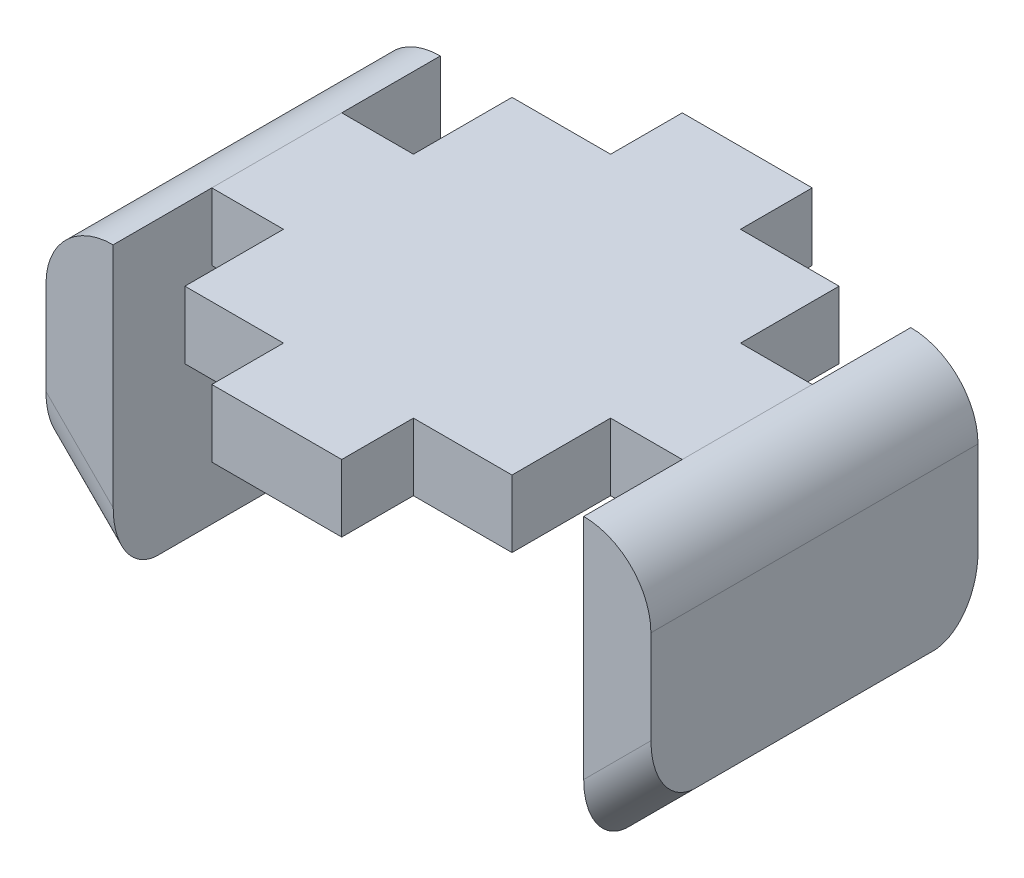
ISO-10303-21;
HEADER;
FILE_DESCRIPTION(('STEP AP214'),'2;1');
FILE_NAME('part.step','',(''),(''),'','','');
FILE_SCHEMA(('AUTOMOTIVE_DESIGN { 1 0 10303 214 1 1 1 1 }'));
ENDSEC;
DATA;
#1=APPLICATION_CONTEXT('core data for automotive mechanical design processes');
#2=APPLICATION_PROTOCOL_DEFINITION('international standard','automotive_design',2000,#1);
#3=PRODUCT_CONTEXT('',#1,'mechanical');
#4=PRODUCT('Part','Part','',(#3));
#5=PRODUCT_RELATED_PRODUCT_CATEGORY('part','',(#4));
#6=PRODUCT_DEFINITION_FORMATION('','',#4);
#7=PRODUCT_DEFINITION_CONTEXT('part definition',#1,'design');
#8=PRODUCT_DEFINITION('design','',#6,#7);
#9=PRODUCT_DEFINITION_SHAPE('','',#8);
#10=(LENGTH_UNIT() NAMED_UNIT(*) SI_UNIT(.MILLI.,.METRE.));
#11=(NAMED_UNIT(*) PLANE_ANGLE_UNIT() SI_UNIT($,.RADIAN.));
#12=(NAMED_UNIT(*) SI_UNIT($,.STERADIAN.) SOLID_ANGLE_UNIT());
#13=UNCERTAINTY_MEASURE_WITH_UNIT(LENGTH_MEASURE(1.E-05),#10,'distance_accuracy_value','');
#14=(GEOMETRIC_REPRESENTATION_CONTEXT(3) GLOBAL_UNCERTAINTY_ASSIGNED_CONTEXT((#13)) GLOBAL_UNIT_ASSIGNED_CONTEXT((#10,
#11,#12)) REPRESENTATION_CONTEXT('',''));
#15=CARTESIAN_POINT('',(0.,0.,0.));
#16=DIRECTION('',(0.,0.,1.));
#17=DIRECTION('',(1.,0.,0.));
#18=AXIS2_PLACEMENT_3D('',#15,#16,#17);
#19=CARTESIAN_POINT('',(7.3,1.5,-7.3));
#20=DIRECTION('',(-1.,0.,0.));
#21=DIRECTION('',(0.,0.,1.));
#22=AXIS2_PLACEMENT_3D('',#19,#20,#21);
#23=PLANE('',#22);
#24=DIRECTION('',(0.,-1.,0.));
#25=VECTOR('',#24,1.);
#26=CARTESIAN_POINT('',(7.3,1.5,2.9));
#27=LINE('',#26,#25);
#28=CARTESIAN_POINT('',(7.3,1.5,2.9));
#29=VERTEX_POINT('',#28);
#30=CARTESIAN_POINT('',(7.3,-1.5,2.9));
#31=VERTEX_POINT('',#30);
#32=EDGE_CURVE('E364',#29,#31,#27,.T.);
#33=ORIENTED_EDGE('',*,*,#32,.F.);
#34=DIRECTION('',(0.,0.,-1.));
#35=VECTOR('',#34,1.);
#36=CARTESIAN_POINT('',(7.3,1.5,-7.3));
#37=LINE('',#36,#35);
#38=CARTESIAN_POINT('',(7.3,1.5,7.3));
#39=VERTEX_POINT('',#38);
#40=EDGE_CURVE('E458',#39,#29,#37,.T.);
#41=ORIENTED_EDGE('',*,*,#40,.F.);
#42=DIRECTION('',(0.,-1.,0.));
#43=VECTOR('',#42,1.);
#44=CARTESIAN_POINT('',(7.3,1.5,7.3));
#45=LINE('',#44,#43);
#46=CARTESIAN_POINT('',(7.3,-1.5,7.3));
#47=VERTEX_POINT('',#46);
#48=EDGE_CURVE('E486',#39,#47,#45,.T.);
#49=ORIENTED_EDGE('',*,*,#48,.T.);
#50=DIRECTION('',(0.,0.,-1.));
#51=VECTOR('',#50,1.);
#52=CARTESIAN_POINT('',(7.3,-1.5,-7.3));
#53=LINE('',#52,#51);
#54=EDGE_CURVE('E474',#47,#31,#53,.T.);
#55=ORIENTED_EDGE('',*,*,#54,.T.);
#56=EDGE_LOOP('',(#33,#41,#49,#55));
#57=FACE_BOUND('',#56,.T.);
#58=ADVANCED_FACE('F43',(#57),#23,.F.);
#59=CARTESIAN_POINT('',(-7.3,1.5,-7.3));
#60=DIRECTION('',(1.,0.,0.));
#61=DIRECTION('',(0.,0.,-1.));
#62=AXIS2_PLACEMENT_3D('',#59,#60,#61);
#63=PLANE('',#62);
#64=DIRECTION('',(0.,-1.,0.));
#65=VECTOR('',#64,1.);
#66=CARTESIAN_POINT('',(-7.3,1.5,-2.9));
#67=LINE('',#66,#65);
#68=CARTESIAN_POINT('',(-7.3,1.5,-2.9));
#69=VERTEX_POINT('',#68);
#70=CARTESIAN_POINT('',(-7.3,-1.5,-2.9));
#71=VERTEX_POINT('',#70);
#72=EDGE_CURVE('E397',#69,#71,#67,.T.);
#73=ORIENTED_EDGE('',*,*,#72,.F.);
#74=DIRECTION('',(0.,0.,1.));
#75=VECTOR('',#74,1.);
#76=CARTESIAN_POINT('',(-7.3,1.5,-7.3));
#77=LINE('',#76,#75);
#78=CARTESIAN_POINT('',(-7.3,1.5,-7.3));
#79=VERTEX_POINT('',#78);
#80=EDGE_CURVE('E449',#79,#69,#77,.T.);
#81=ORIENTED_EDGE('',*,*,#80,.F.);
#82=DIRECTION('',(0.,-1.,0.));
#83=VECTOR('',#82,1.);
#84=CARTESIAN_POINT('',(-7.3,1.5,-7.3));
#85=LINE('',#84,#83);
#86=CARTESIAN_POINT('',(-7.3,-1.5,-7.3));
#87=VERTEX_POINT('',#86);
#88=EDGE_CURVE('E465',#79,#87,#85,.T.);
#89=ORIENTED_EDGE('',*,*,#88,.T.);
#90=DIRECTION('',(0.,0.,1.));
#91=VECTOR('',#90,1.);
#92=CARTESIAN_POINT('',(-7.3,-1.5,-7.3));
#93=LINE('',#92,#91);
#94=EDGE_CURVE('E466',#87,#71,#93,.T.);
#95=ORIENTED_EDGE('',*,*,#94,.T.);
#96=EDGE_LOOP('',(#73,#81,#89,#95));
#97=FACE_BOUND('',#96,.T.);
#98=ADVANCED_FACE('F604',(#97),#63,.F.);
#99=CARTESIAN_POINT('',(-7.3,1.5,7.3));
#100=DIRECTION('',(0.,0.,-1.));
#101=DIRECTION('',(-1.,0.,0.));
#102=AXIS2_PLACEMENT_3D('',#99,#100,#101);
#103=PLANE('',#102);
#104=DIRECTION('',(0.,-1.,0.));
#105=VECTOR('',#104,1.);
#106=CARTESIAN_POINT('',(-2.9,1.5,7.3));
#107=LINE('',#106,#105);
#108=CARTESIAN_POINT('',(-2.9,1.5,7.3));
#109=VERTEX_POINT('',#108);
#110=CARTESIAN_POINT('',(-2.9,-1.5,7.3));
#111=VERTEX_POINT('',#110);
#112=EDGE_CURVE('E421',#109,#111,#107,.T.);
#113=ORIENTED_EDGE('',*,*,#112,.F.);
#114=DIRECTION('',(1.,0.,0.));
#115=VECTOR('',#114,1.);
#116=CARTESIAN_POINT('',(-7.3,1.5,7.3));
#117=LINE('',#116,#115);
#118=CARTESIAN_POINT('',(-7.3,1.5,7.3));
#119=VERTEX_POINT('',#118);
#120=EDGE_CURVE('E454',#119,#109,#117,.T.);
#121=ORIENTED_EDGE('',*,*,#120,.F.);
#122=DIRECTION('',(0.,-1.,0.));
#123=VECTOR('',#122,1.);
#124=CARTESIAN_POINT('',(-7.3,1.5,7.3));
#125=LINE('',#124,#123);
#126=CARTESIAN_POINT('',(-7.3,-1.5,7.3));
#127=VERTEX_POINT('',#126);
#128=EDGE_CURVE('E489',#119,#127,#125,.T.);
#129=ORIENTED_EDGE('',*,*,#128,.T.);
#130=DIRECTION('',(1.,0.,0.));
#131=VECTOR('',#130,1.);
#132=CARTESIAN_POINT('',(-7.3,-1.5,7.3));
#133=LINE('',#132,#131);
#134=EDGE_CURVE('E470',#127,#111,#133,.T.);
#135=ORIENTED_EDGE('',*,*,#134,.T.);
#136=EDGE_LOOP('',(#113,#121,#129,#135));
#137=FACE_BOUND('',#136,.T.);
#138=ADVANCED_FACE('F591',(#137),#103,.F.);
#139=CARTESIAN_POINT('',(-7.3,1.5,-7.3));
#140=DIRECTION('',(0.,0.,1.));
#141=DIRECTION('',(1.,0.,0.));
#142=AXIS2_PLACEMENT_3D('',#139,#140,#141);
#143=PLANE('',#142);
#144=DIRECTION('',(0.,-1.,0.));
#145=VECTOR('',#144,1.);
#146=CARTESIAN_POINT('',(2.9,1.5,-7.3));
#147=LINE('',#146,#145);
#148=CARTESIAN_POINT('',(2.9,1.5,-7.3));
#149=VERTEX_POINT('',#148);
#150=CARTESIAN_POINT('',(2.9,-1.5,-7.3));
#151=VERTEX_POINT('',#150);
#152=EDGE_CURVE('E445',#149,#151,#147,.T.);
#153=ORIENTED_EDGE('',*,*,#152,.F.);
#154=DIRECTION('',(-1.,0.,0.));
#155=VECTOR('',#154,1.);
#156=CARTESIAN_POINT('',(-7.3,1.5,-7.3));
#157=LINE('',#156,#155);
#158=CARTESIAN_POINT('',(7.3,1.5,-7.3));
#159=VERTEX_POINT('',#158);
#160=EDGE_CURVE('E462',#159,#149,#157,.T.);
#161=ORIENTED_EDGE('',*,*,#160,.F.);
#162=DIRECTION('',(0.,-1.,0.));
#163=VECTOR('',#162,1.);
#164=CARTESIAN_POINT('',(7.3,1.5,-7.3));
#165=LINE('',#164,#163);
#166=CARTESIAN_POINT('',(7.3,-1.5,-7.3));
#167=VERTEX_POINT('',#166);
#168=EDGE_CURVE('E483',#159,#167,#165,.T.);
#169=ORIENTED_EDGE('',*,*,#168,.T.);
#170=DIRECTION('',(-1.,0.,0.));
#171=VECTOR('',#170,1.);
#172=CARTESIAN_POINT('',(-7.3,-1.5,-7.3));
#173=LINE('',#172,#171);
#174=EDGE_CURVE('E478',#167,#151,#173,.T.);
#175=ORIENTED_EDGE('',*,*,#174,.T.);
#176=EDGE_LOOP('',(#153,#161,#169,#175));
#177=FACE_BOUND('',#176,.T.);
#178=ADVANCED_FACE('F620',(#177),#143,.F.);
#179=CARTESIAN_POINT('',(-7.3,1.5,2.9));
#180=VERTEX_POINT('',#179);
#181=EDGE_CURVE('E453',#180,#119,#77,.T.);
#182=ORIENTED_EDGE('',*,*,#181,.F.);
#183=DIRECTION('',(0.,-1.,0.));
#184=VECTOR('',#183,1.);
#185=CARTESIAN_POINT('',(-7.3,1.5,2.9));
#186=LINE('',#185,#184);
#187=CARTESIAN_POINT('',(-7.3,-1.5,2.9));
#188=VERTEX_POINT('',#187);
#189=EDGE_CURVE('E383',#180,#188,#186,.T.);
#190=ORIENTED_EDGE('',*,*,#189,.T.);
#191=EDGE_CURVE('E448',#188,#127,#93,.T.);
#192=ORIENTED_EDGE('',*,*,#191,.T.);
#193=ORIENTED_EDGE('',*,*,#128,.F.);
#194=EDGE_LOOP('',(#182,#190,#192,#193));
#195=FACE_BOUND('',#194,.T.);
#196=ADVANCED_FACE('F594',(#195),#63,.F.);
#197=CARTESIAN_POINT('',(2.9,1.5,7.3));
#198=VERTEX_POINT('',#197);
#199=EDGE_CURVE('E452',#198,#39,#117,.T.);
#200=ORIENTED_EDGE('',*,*,#199,.F.);
#201=DIRECTION('',(0.,-1.,0.));
#202=VECTOR('',#201,1.);
#203=CARTESIAN_POINT('',(2.9,1.5,7.3));
#204=LINE('',#203,#202);
#205=CARTESIAN_POINT('',(2.9,-1.5,7.3));
#206=VERTEX_POINT('',#205);
#207=EDGE_CURVE('E408',#198,#206,#204,.T.);
#208=ORIENTED_EDGE('',*,*,#207,.T.);
#209=EDGE_CURVE('E469',#206,#47,#133,.T.);
#210=ORIENTED_EDGE('',*,*,#209,.T.);
#211=ORIENTED_EDGE('',*,*,#48,.F.);
#212=EDGE_LOOP('',(#200,#208,#210,#211));
#213=FACE_BOUND('',#212,.T.);
#214=ADVANCED_FACE('F574',(#213),#103,.F.);
#215=CARTESIAN_POINT('',(7.3,1.5,-2.9));
#216=VERTEX_POINT('',#215);
#217=EDGE_CURVE('E457',#216,#159,#37,.T.);
#218=ORIENTED_EDGE('',*,*,#217,.F.);
#219=DIRECTION('',(0.,-1.,0.));
#220=VECTOR('',#219,1.);
#221=CARTESIAN_POINT('',(7.3,1.5,-2.9));
#222=LINE('',#221,#220);
#223=CARTESIAN_POINT('',(7.3,-1.5,-2.9));
#224=VERTEX_POINT('',#223);
#225=EDGE_CURVE('E370',#216,#224,#222,.T.);
#226=ORIENTED_EDGE('',*,*,#225,.T.);
#227=EDGE_CURVE('E473',#224,#167,#53,.T.);
#228=ORIENTED_EDGE('',*,*,#227,.T.);
#229=ORIENTED_EDGE('',*,*,#168,.F.);
#230=EDGE_LOOP('',(#218,#226,#228,#229));
#231=FACE_BOUND('',#230,.T.);
#232=ADVANCED_FACE('F563',(#231),#23,.F.);
#233=CARTESIAN_POINT('',(-2.9,1.5,-7.3));
#234=VERTEX_POINT('',#233);
#235=EDGE_CURVE('E461',#234,#79,#157,.T.);
#236=ORIENTED_EDGE('',*,*,#235,.F.);
#237=DIRECTION('',(0.,-1.,0.));
#238=VECTOR('',#237,1.);
#239=CARTESIAN_POINT('',(-2.9,1.5,-7.3));
#240=LINE('',#239,#238);
#241=CARTESIAN_POINT('',(-2.9,-1.5,-7.3));
#242=VERTEX_POINT('',#241);
#243=EDGE_CURVE('E432',#234,#242,#240,.T.);
#244=ORIENTED_EDGE('',*,*,#243,.T.);
#245=EDGE_CURVE('E477',#242,#87,#173,.T.);
#246=ORIENTED_EDGE('',*,*,#245,.T.);
#247=ORIENTED_EDGE('',*,*,#88,.F.);
#248=EDGE_LOOP('',(#236,#244,#246,#247));
#249=FACE_BOUND('',#248,.T.);
#250=ADVANCED_FACE('F614',(#249),#143,.F.);
#251=CARTESIAN_POINT('',(0.,1.5,0.));
#252=DIRECTION('',(0.,1.,0.));
#253=DIRECTION('',(0.,0.,1.));
#254=AXIS2_PLACEMENT_3D('',#251,#252,#253);
#255=PLANE('',#254);
#256=DIRECTION('',(-1.,0.,0.));
#257=VECTOR('',#256,1.);
#258=CARTESIAN_POINT('',(-7.3,1.5,-2.9));
#259=LINE('',#258,#257);
#260=CARTESIAN_POINT('',(-10.5,1.5,-2.9));
#261=VERTEX_POINT('',#260);
#262=EDGE_CURVE('E378',#69,#261,#259,.T.);
#263=ORIENTED_EDGE('',*,*,#262,.T.);
#264=DIRECTION('',(0.,0.,-1.));
#265=VECTOR('',#264,1.);
#266=CARTESIAN_POINT('',(-10.5,1.5,0.));
#267=LINE('',#266,#265);
#268=CARTESIAN_POINT('',(-10.5,1.5,2.9));
#269=VERTEX_POINT('',#268);
#270=EDGE_CURVE('E285',#261,#269,#267,.F.);
#271=ORIENTED_EDGE('',*,*,#270,.T.);
#272=DIRECTION('',(1.,0.,0.));
#273=VECTOR('',#272,1.);
#274=CARTESIAN_POINT('',(-10.5,1.5,2.9));
#275=LINE('',#274,#273);
#276=EDGE_CURVE('E380',#269,#180,#275,.T.);
#277=ORIENTED_EDGE('',*,*,#276,.T.);
#278=ORIENTED_EDGE('',*,*,#181,.T.);
#279=ORIENTED_EDGE('',*,*,#120,.T.);
#280=DIRECTION('',(0.,0.,1.));
#281=VECTOR('',#280,1.);
#282=CARTESIAN_POINT('',(-2.9,1.5,7.3));
#283=LINE('',#282,#281);
#284=CARTESIAN_POINT('',(-2.9,1.5,10.5));
#285=VERTEX_POINT('',#284);
#286=EDGE_CURVE('E401',#109,#285,#283,.T.);
#287=ORIENTED_EDGE('',*,*,#286,.T.);
#288=DIRECTION('',(1.,0.,0.));
#289=VECTOR('',#288,1.);
#290=CARTESIAN_POINT('',(-2.9,1.5,10.5));
#291=LINE('',#290,#289);
#292=CARTESIAN_POINT('',(2.9,1.5,10.5));
#293=VERTEX_POINT('',#292);
#294=EDGE_CURVE('E403',#285,#293,#291,.T.);
#295=ORIENTED_EDGE('',*,*,#294,.T.);
#296=DIRECTION('',(0.,0.,-1.));
#297=VECTOR('',#296,1.);
#298=CARTESIAN_POINT('',(2.9,1.5,10.5));
#299=LINE('',#298,#297);
#300=EDGE_CURVE('E406',#293,#198,#299,.T.);
#301=ORIENTED_EDGE('',*,*,#300,.T.);
#302=ORIENTED_EDGE('',*,*,#199,.T.);
#303=ORIENTED_EDGE('',*,*,#40,.T.);
#304=DIRECTION('',(1.,0.,0.));
#305=VECTOR('',#304,1.);
#306=CARTESIAN_POINT('',(10.5,1.5,2.9));
#307=LINE('',#306,#305);
#308=CARTESIAN_POINT('',(10.5,1.5,2.9));
#309=VERTEX_POINT('',#308);
#310=EDGE_CURVE('E358',#29,#309,#307,.T.);
#311=ORIENTED_EDGE('',*,*,#310,.T.);
#312=DIRECTION('',(0.,0.,-1.));
#313=VECTOR('',#312,1.);
#314=CARTESIAN_POINT('',(10.5,1.5,0.));
#315=LINE('',#314,#313);
#316=CARTESIAN_POINT('',(10.5,1.5,-2.9));
#317=VERTEX_POINT('',#316);
#318=EDGE_CURVE('E496',#309,#317,#315,.T.);
#319=ORIENTED_EDGE('',*,*,#318,.T.);
#320=DIRECTION('',(-1.,0.,0.));
#321=VECTOR('',#320,1.);
#322=CARTESIAN_POINT('',(7.3,1.5,-2.9));
#323=LINE('',#322,#321);
#324=EDGE_CURVE('E361',#317,#216,#323,.T.);
#325=ORIENTED_EDGE('',*,*,#324,.T.);
#326=ORIENTED_EDGE('',*,*,#217,.T.);
#327=ORIENTED_EDGE('',*,*,#160,.T.);
#328=DIRECTION('',(0.,0.,-1.));
#329=VECTOR('',#328,1.);
#330=CARTESIAN_POINT('',(2.9,1.5,-10.5));
#331=LINE('',#330,#329);
#332=CARTESIAN_POINT('',(2.9,1.5,-10.5));
#333=VERTEX_POINT('',#332);
#334=EDGE_CURVE('E425',#149,#333,#331,.T.);
#335=ORIENTED_EDGE('',*,*,#334,.T.);
#336=DIRECTION('',(-1.,0.,0.));
#337=VECTOR('',#336,1.);
#338=CARTESIAN_POINT('',(-2.9,1.5,-10.5));
#339=LINE('',#338,#337);
#340=CARTESIAN_POINT('',(-2.9,1.5,-10.5));
#341=VERTEX_POINT('',#340);
#342=EDGE_CURVE('E427',#333,#341,#339,.T.);
#343=ORIENTED_EDGE('',*,*,#342,.T.);
#344=DIRECTION('',(0.,0.,1.));
#345=VECTOR('',#344,1.);
#346=CARTESIAN_POINT('',(-2.9,1.5,-7.3));
#347=LINE('',#346,#345);
#348=EDGE_CURVE('E430',#341,#234,#347,.T.);
#349=ORIENTED_EDGE('',*,*,#348,.T.);
#350=ORIENTED_EDGE('',*,*,#235,.T.);
#351=ORIENTED_EDGE('',*,*,#80,.T.);
#352=EDGE_LOOP('',(#263,#271,#277,#278,#279,#287,#295,#301,#302,#303,#311,#319,#325,#326,#327,
#335,#343,#349,#350,#351));
#353=FACE_BOUND('',#352,.T.);
#354=ADVANCED_FACE('F500',(#353),#255,.T.);
#355=CARTESIAN_POINT('',(0.,-1.5,0.));
#356=DIRECTION('',(0.,1.,0.));
#357=DIRECTION('',(0.,0.,1.));
#358=AXIS2_PLACEMENT_3D('',#355,#356,#357);
#359=PLANE('',#358);
#360=ORIENTED_EDGE('',*,*,#94,.F.);
#361=ORIENTED_EDGE('',*,*,#245,.F.);
#362=DIRECTION('',(0.,0.,1.));
#363=VECTOR('',#362,1.);
#364=CARTESIAN_POINT('',(-2.9,-1.5,-7.3));
#365=LINE('',#364,#363);
#366=CARTESIAN_POINT('',(-2.9,-1.5,-10.5));
#367=VERTEX_POINT('',#366);
#368=EDGE_CURVE('E428',#367,#242,#365,.T.);
#369=ORIENTED_EDGE('',*,*,#368,.F.);
#370=DIRECTION('',(-1.,0.,0.));
#371=VECTOR('',#370,1.);
#372=CARTESIAN_POINT('',(-2.9,-1.5,-10.5));
#373=LINE('',#372,#371);
#374=CARTESIAN_POINT('',(2.9,-1.5,-10.5));
#375=VERTEX_POINT('',#374);
#376=EDGE_CURVE('E434',#375,#367,#373,.T.);
#377=ORIENTED_EDGE('',*,*,#376,.F.);
#378=DIRECTION('',(0.,0.,-1.));
#379=VECTOR('',#378,1.);
#380=CARTESIAN_POINT('',(2.9,-1.5,-10.5));
#381=LINE('',#380,#379);
#382=EDGE_CURVE('E424',#151,#375,#381,.T.);
#383=ORIENTED_EDGE('',*,*,#382,.F.);
#384=ORIENTED_EDGE('',*,*,#174,.F.);
#385=ORIENTED_EDGE('',*,*,#227,.F.);
#386=DIRECTION('',(-1.,0.,0.));
#387=VECTOR('',#386,1.);
#388=CARTESIAN_POINT('',(7.3,-1.5,-2.9));
#389=LINE('',#388,#387);
#390=CARTESIAN_POINT('',(10.5,-1.5,-2.9));
#391=VERTEX_POINT('',#390);
#392=EDGE_CURVE('E362',#391,#224,#389,.T.);
#393=ORIENTED_EDGE('',*,*,#392,.F.);
#394=DIRECTION('',(0.,0.,-1.));
#395=VECTOR('',#394,1.);
#396=CARTESIAN_POINT('',(10.5,-1.5,-2.9));
#397=LINE('',#396,#395);
#398=CARTESIAN_POINT('',(10.5,-1.5,2.9));
#399=VERTEX_POINT('',#398);
#400=EDGE_CURVE('E366',#399,#391,#397,.T.);
#401=ORIENTED_EDGE('',*,*,#400,.F.);
#402=DIRECTION('',(1.,0.,0.));
#403=VECTOR('',#402,1.);
#404=CARTESIAN_POINT('',(10.5,-1.5,2.9));
#405=LINE('',#404,#403);
#406=EDGE_CURVE('E335',#31,#399,#405,.T.);
#407=ORIENTED_EDGE('',*,*,#406,.F.);
#408=ORIENTED_EDGE('',*,*,#54,.F.);
#409=ORIENTED_EDGE('',*,*,#209,.F.);
#410=DIRECTION('',(0.,0.,-1.));
#411=VECTOR('',#410,1.);
#412=CARTESIAN_POINT('',(2.9,-1.5,10.5));
#413=LINE('',#412,#411);
#414=CARTESIAN_POINT('',(2.9,-1.5,10.5));
#415=VERTEX_POINT('',#414);
#416=EDGE_CURVE('E404',#415,#206,#413,.T.);
#417=ORIENTED_EDGE('',*,*,#416,.F.);
#418=DIRECTION('',(1.,0.,0.));
#419=VECTOR('',#418,1.);
#420=CARTESIAN_POINT('',(-2.9,-1.5,10.5));
#421=LINE('',#420,#419);
#422=CARTESIAN_POINT('',(-2.9,-1.5,10.5));
#423=VERTEX_POINT('',#422);
#424=EDGE_CURVE('E410',#423,#415,#421,.T.);
#425=ORIENTED_EDGE('',*,*,#424,.F.);
#426=DIRECTION('',(0.,0.,1.));
#427=VECTOR('',#426,1.);
#428=CARTESIAN_POINT('',(-2.9,-1.5,7.3));
#429=LINE('',#428,#427);
#430=EDGE_CURVE('E400',#111,#423,#429,.T.);
#431=ORIENTED_EDGE('',*,*,#430,.F.);
#432=ORIENTED_EDGE('',*,*,#134,.F.);
#433=ORIENTED_EDGE('',*,*,#191,.F.);
#434=DIRECTION('',(1.,0.,0.));
#435=VECTOR('',#434,1.);
#436=CARTESIAN_POINT('',(-10.5,-1.5,2.9));
#437=LINE('',#436,#435);
#438=CARTESIAN_POINT('',(-10.5,-1.5,2.9));
#439=VERTEX_POINT('',#438);
#440=EDGE_CURVE('E381',#439,#188,#437,.T.);
#441=ORIENTED_EDGE('',*,*,#440,.F.);
#442=DIRECTION('',(0.,0.,1.));
#443=VECTOR('',#442,1.);
#444=CARTESIAN_POINT('',(-10.5,-1.5,-2.9));
#445=LINE('',#444,#443);
#446=CARTESIAN_POINT('',(-10.5,-1.5,-2.9));
#447=VERTEX_POINT('',#446);
#448=EDGE_CURVE('E386',#447,#439,#445,.T.);
#449=ORIENTED_EDGE('',*,*,#448,.F.);
#450=DIRECTION('',(-1.,0.,0.));
#451=VECTOR('',#450,1.);
#452=CARTESIAN_POINT('',(-7.3,-1.5,-2.9));
#453=LINE('',#452,#451);
#454=EDGE_CURVE('E377',#71,#447,#453,.T.);
#455=ORIENTED_EDGE('',*,*,#454,.F.);
#456=EDGE_LOOP('',(#360,#361,#369,#377,#383,#384,#385,#393,#401,#407,#408,#409,#417,#425,#431,
#432,#433,#441,#449,#455));
#457=FACE_BOUND('',#456,.T.);
#458=ADVANCED_FACE('F554',(#457),#359,.F.);
#459=CARTESIAN_POINT('',(2.9,1.5,-10.5));
#460=DIRECTION('',(-1.,0.,0.));
#461=DIRECTION('',(0.,0.,1.));
#462=AXIS2_PLACEMENT_3D('',#459,#460,#461);
#463=PLANE('',#462);
#464=ORIENTED_EDGE('',*,*,#382,.T.);
#465=DIRECTION('',(0.,-1.,0.));
#466=VECTOR('',#465,1.);
#467=CARTESIAN_POINT('',(2.9,1.5,-10.5));
#468=LINE('',#467,#466);
#469=EDGE_CURVE('E442',#333,#375,#468,.T.);
#470=ORIENTED_EDGE('',*,*,#469,.F.);
#471=ORIENTED_EDGE('',*,*,#334,.F.);
#472=ORIENTED_EDGE('',*,*,#152,.T.);
#473=EDGE_LOOP('',(#464,#470,#471,#472));
#474=FACE_BOUND('',#473,.T.);
#475=ADVANCED_FACE('F635',(#474),#463,.F.);
#476=CARTESIAN_POINT('',(-2.9,1.5,-10.5));
#477=DIRECTION('',(0.,0.,1.));
#478=DIRECTION('',(1.,0.,0.));
#479=AXIS2_PLACEMENT_3D('',#476,#477,#478);
#480=PLANE('',#479);
#481=ORIENTED_EDGE('',*,*,#376,.T.);
#482=DIRECTION('',(0.,-1.,0.));
#483=VECTOR('',#482,1.);
#484=CARTESIAN_POINT('',(-2.9,1.5,-10.5));
#485=LINE('',#484,#483);
#486=EDGE_CURVE('E439',#341,#367,#485,.T.);
#487=ORIENTED_EDGE('',*,*,#486,.F.);
#488=ORIENTED_EDGE('',*,*,#342,.F.);
#489=ORIENTED_EDGE('',*,*,#469,.T.);
#490=EDGE_LOOP('',(#481,#487,#488,#489));
#491=FACE_BOUND('',#490,.T.);
#492=ADVANCED_FACE('F640',(#491),#480,.F.);
#493=CARTESIAN_POINT('',(-2.9,1.5,-7.3));
#494=DIRECTION('',(1.,0.,0.));
#495=DIRECTION('',(0.,0.,-1.));
#496=AXIS2_PLACEMENT_3D('',#493,#494,#495);
#497=PLANE('',#496);
#498=ORIENTED_EDGE('',*,*,#368,.T.);
#499=ORIENTED_EDGE('',*,*,#243,.F.);
#500=ORIENTED_EDGE('',*,*,#348,.F.);
#501=ORIENTED_EDGE('',*,*,#486,.T.);
#502=EDGE_LOOP('',(#498,#499,#500,#501));
#503=FACE_BOUND('',#502,.T.);
#504=ADVANCED_FACE('F644',(#503),#497,.F.);
#505=CARTESIAN_POINT('',(-2.9,1.5,7.3));
#506=DIRECTION('',(1.,0.,0.));
#507=DIRECTION('',(0.,0.,-1.));
#508=AXIS2_PLACEMENT_3D('',#505,#506,#507);
#509=PLANE('',#508);
#510=ORIENTED_EDGE('',*,*,#430,.T.);
#511=DIRECTION('',(0.,-1.,0.));
#512=VECTOR('',#511,1.);
#513=CARTESIAN_POINT('',(-2.9,1.5,10.5));
#514=LINE('',#513,#512);
#515=EDGE_CURVE('E418',#285,#423,#514,.T.);
#516=ORIENTED_EDGE('',*,*,#515,.F.);
#517=ORIENTED_EDGE('',*,*,#286,.F.);
#518=ORIENTED_EDGE('',*,*,#112,.T.);
#519=EDGE_LOOP('',(#510,#516,#517,#518));
#520=FACE_BOUND('',#519,.T.);
#521=ADVANCED_FACE('F588',(#520),#509,.F.);
#522=CARTESIAN_POINT('',(-2.9,1.5,10.5));
#523=DIRECTION('',(0.,0.,-1.));
#524=DIRECTION('',(-1.,0.,0.));
#525=AXIS2_PLACEMENT_3D('',#522,#523,#524);
#526=PLANE('',#525);
#527=ORIENTED_EDGE('',*,*,#424,.T.);
#528=DIRECTION('',(0.,-1.,0.));
#529=VECTOR('',#528,1.);
#530=CARTESIAN_POINT('',(2.9,1.5,10.5));
#531=LINE('',#530,#529);
#532=EDGE_CURVE('E415',#293,#415,#531,.T.);
#533=ORIENTED_EDGE('',*,*,#532,.F.);
#534=ORIENTED_EDGE('',*,*,#294,.F.);
#535=ORIENTED_EDGE('',*,*,#515,.T.);
#536=EDGE_LOOP('',(#527,#533,#534,#535));
#537=FACE_BOUND('',#536,.T.);
#538=ADVANCED_FACE('F582',(#537),#526,.F.);
#539=CARTESIAN_POINT('',(2.9,1.5,10.5));
#540=DIRECTION('',(-1.,0.,0.));
#541=DIRECTION('',(0.,0.,1.));
#542=AXIS2_PLACEMENT_3D('',#539,#540,#541);
#543=PLANE('',#542);
#544=ORIENTED_EDGE('',*,*,#416,.T.);
#545=ORIENTED_EDGE('',*,*,#207,.F.);
#546=ORIENTED_EDGE('',*,*,#300,.F.);
#547=ORIENTED_EDGE('',*,*,#532,.T.);
#548=EDGE_LOOP('',(#544,#545,#546,#547));
#549=FACE_BOUND('',#548,.T.);
#550=ADVANCED_FACE('F578',(#549),#543,.F.);
#551=CARTESIAN_POINT('',(-7.3,1.5,-2.9));
#552=DIRECTION('',(0.,0.,1.));
#553=DIRECTION('',(1.,0.,0.));
#554=AXIS2_PLACEMENT_3D('',#551,#552,#553);
#555=PLANE('',#554);
#556=ORIENTED_EDGE('',*,*,#454,.T.);
#557=DIRECTION('',(0.,-1.,0.));
#558=VECTOR('',#557,1.);
#559=CARTESIAN_POINT('',(-10.5,1.5,-2.9));
#560=LINE('',#559,#558);
#561=EDGE_CURVE('E394',#261,#447,#560,.T.);
#562=ORIENTED_EDGE('',*,*,#561,.F.);
#563=ORIENTED_EDGE('',*,*,#262,.F.);
#564=ORIENTED_EDGE('',*,*,#72,.T.);
#565=EDGE_LOOP('',(#556,#562,#563,#564));
#566=FACE_BOUND('',#565,.T.);
#567=ADVANCED_FACE('F596',(#566),#555,.F.);
#568=CARTESIAN_POINT('',(-10.5,1.5,2.9));
#569=DIRECTION('',(0.,0.,-1.));
#570=DIRECTION('',(-1.,0.,0.));
#571=AXIS2_PLACEMENT_3D('',#568,#569,#570);
#572=PLANE('',#571);
#573=ORIENTED_EDGE('',*,*,#440,.T.);
#574=ORIENTED_EDGE('',*,*,#189,.F.);
#575=ORIENTED_EDGE('',*,*,#276,.F.);
#576=DIRECTION('',(0.,-1.,0.));
#577=VECTOR('',#576,1.);
#578=CARTESIAN_POINT('',(-10.5,1.5,2.9));
#579=LINE('',#578,#577);
#580=EDGE_CURVE('E392',#269,#439,#579,.T.);
#581=ORIENTED_EDGE('',*,*,#580,.T.);
#582=EDGE_LOOP('',(#573,#574,#575,#581));
#583=FACE_BOUND('',#582,.T.);
#584=ADVANCED_FACE('F507',(#583),#572,.F.);
#585=CARTESIAN_POINT('',(10.5,1.5,2.9));
#586=DIRECTION('',(0.,0.,-1.));
#587=DIRECTION('',(-1.,0.,0.));
#588=AXIS2_PLACEMENT_3D('',#585,#586,#587);
#589=PLANE('',#588);
#590=ORIENTED_EDGE('',*,*,#406,.T.);
#591=DIRECTION('',(0.,-1.,0.));
#592=VECTOR('',#591,1.);
#593=CARTESIAN_POINT('',(10.5,1.5,2.9));
#594=LINE('',#593,#592);
#595=EDGE_CURVE('E374',#309,#399,#594,.T.);
#596=ORIENTED_EDGE('',*,*,#595,.F.);
#597=ORIENTED_EDGE('',*,*,#310,.F.);
#598=ORIENTED_EDGE('',*,*,#32,.T.);
#599=EDGE_LOOP('',(#590,#596,#597,#598));
#600=FACE_BOUND('',#599,.T.);
#601=ADVANCED_FACE('F547',(#600),#589,.F.);
#602=CARTESIAN_POINT('',(7.3,1.5,-2.9));
#603=DIRECTION('',(0.,0.,1.));
#604=DIRECTION('',(1.,0.,0.));
#605=AXIS2_PLACEMENT_3D('',#602,#603,#604);
#606=PLANE('',#605);
#607=ORIENTED_EDGE('',*,*,#392,.T.);
#608=ORIENTED_EDGE('',*,*,#225,.F.);
#609=ORIENTED_EDGE('',*,*,#324,.F.);
#610=DIRECTION('',(0.,-1.,0.));
#611=VECTOR('',#610,1.);
#612=CARTESIAN_POINT('',(10.5,1.5,-2.9));
#613=LINE('',#612,#611);
#614=EDGE_CURVE('E261',#317,#391,#613,.T.);
#615=ORIENTED_EDGE('',*,*,#614,.T.);
#616=EDGE_LOOP('',(#607,#608,#609,#615));
#617=FACE_BOUND('',#616,.T.);
#618=ADVANCED_FACE('F559',(#617),#606,.F.);
#619=CARTESIAN_POINT('',(-13.5,1.5,-7.3));
#620=DIRECTION('',(0.,0.,1.));
#621=DIRECTION('',(0.,-1.,0.));
#622=AXIS2_PLACEMENT_3D('',#619,#620,#621);
#623=PLANE('',#622);
#624=DIRECTION('',(0.,-1.,0.));
#625=VECTOR('',#624,1.);
#626=CARTESIAN_POINT('',(-10.5,1.5,-7.3));
#627=LINE('',#626,#625);
#628=CARTESIAN_POINT('',(-10.5,1.5,-7.3));
#629=VERTEX_POINT('',#628);
#630=CARTESIAN_POINT('',(-10.5,-8.6715728752538,-7.3));
#631=VERTEX_POINT('',#630);
#632=EDGE_CURVE('E347',#629,#631,#627,.T.);
#633=ORIENTED_EDGE('',*,*,#632,.T.);
#634=DIRECTION('',(-0.707106781186549,0.707106781186546,0.));
#635=VECTOR('',#634,1.);
#636=CARTESIAN_POINT('',(-12.0857864376269,-7.0857864376269,-7.3));
#637=LINE('',#636,#635);
#638=CARTESIAN_POINT('',(-13.5,-5.67157287525381,-7.3));
#639=VERTEX_POINT('',#638);
#640=EDGE_CURVE('E11',#631,#639,#637,.T.);
#641=ORIENTED_EDGE('',*,*,#640,.T.);
#642=DIRECTION('',(0.,-1.,0.));
#643=VECTOR('',#642,1.);
#644=CARTESIAN_POINT('',(-13.5,1.5,-7.3));
#645=LINE('',#644,#643);
#646=CARTESIAN_POINT('',(-13.5,-1.5,-7.3));
#647=VERTEX_POINT('',#646);
#648=EDGE_CURVE('E336',#647,#639,#645,.T.);
#649=ORIENTED_EDGE('',*,*,#648,.F.);
#650=CARTESIAN_POINT('',(-10.5,-1.5,-7.3));
#651=DIRECTION('',(0.,0.,1.));
#652=DIRECTION('',(0.,-1.,0.));
#653=AXIS2_PLACEMENT_3D('',#650,#651,#652);
#654=CIRCLE('',#653,3.);
#655=EDGE_CURVE('E494',#647,#629,#654,.F.);
#656=ORIENTED_EDGE('',*,*,#655,.T.);
#657=EDGE_LOOP('',(#633,#641,#649,#656));
#658=FACE_BOUND('',#657,.T.);
#659=ADVANCED_FACE('F514',(#658),#623,.F.);
#660=CARTESIAN_POINT('',(-13.5,1.5,7.3));
#661=DIRECTION('',(0.,0.,-1.));
#662=DIRECTION('',(0.,1.,0.));
#663=AXIS2_PLACEMENT_3D('',#660,#661,#662);
#664=PLANE('',#663);
#665=DIRECTION('',(0.,1.,0.));
#666=VECTOR('',#665,1.);
#667=CARTESIAN_POINT('',(-13.5,1.5,7.3));
#668=LINE('',#667,#666);
#669=CARTESIAN_POINT('',(-13.5,-5.67157287525381,7.3));
#670=VERTEX_POINT('',#669);
#671=CARTESIAN_POINT('',(-13.5,-1.5,7.3));
#672=VERTEX_POINT('',#671);
#673=EDGE_CURVE('E327',#670,#672,#668,.T.);
#674=ORIENTED_EDGE('',*,*,#673,.F.);
#675=DIRECTION('',(0.707106781186549,-0.707106781186546,0.));
#676=VECTOR('',#675,1.);
#677=CARTESIAN_POINT('',(-9.0857864376269,-10.0857864376269,7.3));
#678=LINE('',#677,#676);
#679=CARTESIAN_POINT('',(-10.5,-8.6715728752538,7.3));
#680=VERTEX_POINT('',#679);
#681=EDGE_CURVE('E312',#670,#680,#678,.T.);
#682=ORIENTED_EDGE('',*,*,#681,.T.);
#683=DIRECTION('',(0.,1.,0.));
#684=VECTOR('',#683,1.);
#685=CARTESIAN_POINT('',(-10.5,1.5,7.3));
#686=LINE('',#685,#684);
#687=CARTESIAN_POINT('',(-10.5,1.5,7.3));
#688=VERTEX_POINT('',#687);
#689=EDGE_CURVE('E345',#680,#688,#686,.T.);
#690=ORIENTED_EDGE('',*,*,#689,.T.);
#691=CARTESIAN_POINT('',(-10.5,-1.5,7.3));
#692=DIRECTION('',(0.,0.,-1.));
#693=DIRECTION('',(0.,1.,0.));
#694=AXIS2_PLACEMENT_3D('',#691,#692,#693);
#695=CIRCLE('',#694,3.);
#696=EDGE_CURVE('E280',#688,#672,#695,.F.);
#697=ORIENTED_EDGE('',*,*,#696,.T.);
#698=EDGE_LOOP('',(#674,#682,#690,#697));
#699=FACE_BOUND('',#698,.T.);
#700=ADVANCED_FACE('F331',(#699),#664,.F.);
#701=CARTESIAN_POINT('',(-13.5,0.,0.));
#702=DIRECTION('',(-1.,0.,0.));
#703=DIRECTION('',(0.,0.,1.));
#704=AXIS2_PLACEMENT_3D('',#701,#702,#703);
#705=PLANE('',#704);
#706=DIRECTION('',(0.,0.,1.));
#707=VECTOR('',#706,1.);
#708=CARTESIAN_POINT('',(-13.5,-8.5,7.3));
#709=LINE('',#708,#707);
#710=CARTESIAN_POINT('',(-13.5,-8.5,-5.3));
#711=VERTEX_POINT('',#710);
#712=CARTESIAN_POINT('',(-13.5,-8.5,5.3));
#713=VERTEX_POINT('',#712);
#714=EDGE_CURVE('E291',#711,#713,#709,.T.);
#715=ORIENTED_EDGE('',*,*,#714,.T.);
#716=CARTESIAN_POINT('',(-13.5,-5.67157287525381,5.3));
#717=DIRECTION('',(-1.,0.,0.));
#718=DIRECTION('',(0.,1.,0.));
#719=AXIS2_PLACEMENT_3D('',#716,#717,#718);
#720=ELLIPSE('',#719,2.82842712474619,2.);
#721=EDGE_CURVE('E51',#713,#670,#720,.T.);
#722=ORIENTED_EDGE('',*,*,#721,.T.);
#723=ORIENTED_EDGE('',*,*,#673,.T.);
#724=DIRECTION('',(0.,0.,-1.));
#725=VECTOR('',#724,1.);
#726=CARTESIAN_POINT('',(-13.5,-1.5,0.));
#727=LINE('',#726,#725);
#728=EDGE_CURVE('E492',#672,#647,#727,.T.);
#729=ORIENTED_EDGE('',*,*,#728,.T.);
#730=ORIENTED_EDGE('',*,*,#648,.T.);
#731=CARTESIAN_POINT('',(-13.5,-5.67157287525381,-5.3));
#732=DIRECTION('',(-1.,0.,0.));
#733=DIRECTION('',(0.,-1.,0.));
#734=AXIS2_PLACEMENT_3D('',#731,#732,#733);
#735=ELLIPSE('',#734,2.82842712474619,2.);
#736=EDGE_CURVE('E58',#639,#711,#735,.T.);
#737=ORIENTED_EDGE('',*,*,#736,.T.);
#738=EDGE_LOOP('',(#715,#722,#723,#729,#730,#737));
#739=FACE_BOUND('',#738,.T.);
#740=ADVANCED_FACE('F325',(#739),#705,.T.);
#741=CARTESIAN_POINT('',(-10.5,0.,0.));
#742=DIRECTION('',(-1.,0.,0.));
#743=DIRECTION('',(0.,0.,1.));
#744=AXIS2_PLACEMENT_3D('',#741,#742,#743);
#745=PLANE('',#744);
#746=ORIENTED_EDGE('',*,*,#689,.F.);
#747=CARTESIAN_POINT('',(-10.5,-8.6715728752538,5.3));
#748=DIRECTION('',(-1.,0.,0.));
#749=DIRECTION('',(0.,1.,0.));
#750=AXIS2_PLACEMENT_3D('',#747,#748,#749);
#751=ELLIPSE('',#750,2.82842712474619,2.);
#752=CARTESIAN_POINT('',(-10.5,-11.5,5.3));
#753=VERTEX_POINT('',#752);
#754=EDGE_CURVE('E317',#680,#753,#751,.F.);
#755=ORIENTED_EDGE('',*,*,#754,.T.);
#756=DIRECTION('',(0.,0.,1.));
#757=VECTOR('',#756,1.);
#758=CARTESIAN_POINT('',(-10.5,-11.5,-7.3));
#759=LINE('',#758,#757);
#760=CARTESIAN_POINT('',(-10.5,-11.5,-5.3));
#761=VERTEX_POINT('',#760);
#762=EDGE_CURVE('E342',#761,#753,#759,.T.);
#763=ORIENTED_EDGE('',*,*,#762,.F.);
#764=CARTESIAN_POINT('',(-10.5,-8.6715728752538,-5.3));
#765=DIRECTION('',(-1.,0.,0.));
#766=DIRECTION('',(0.,-1.,0.));
#767=AXIS2_PLACEMENT_3D('',#764,#765,#766);
#768=ELLIPSE('',#767,2.82842712474619,2.);
#769=EDGE_CURVE('E315',#761,#631,#768,.F.);
#770=ORIENTED_EDGE('',*,*,#769,.T.);
#771=ORIENTED_EDGE('',*,*,#632,.F.);
#772=DIRECTION('',(0.,0.,-1.));
#773=VECTOR('',#772,1.);
#774=CARTESIAN_POINT('',(-10.5,1.5,-7.3));
#775=LINE('',#774,#773);
#776=EDGE_CURVE('E349',#261,#629,#775,.T.);
#777=ORIENTED_EDGE('',*,*,#776,.F.);
#778=ORIENTED_EDGE('',*,*,#561,.T.);
#779=ORIENTED_EDGE('',*,*,#448,.T.);
#780=ORIENTED_EDGE('',*,*,#580,.F.);
#781=EDGE_CURVE('E355',#688,#269,#775,.T.);
#782=ORIENTED_EDGE('',*,*,#781,.F.);
#783=EDGE_LOOP('',(#746,#755,#763,#770,#771,#777,#778,#779,#780,#782));
#784=FACE_BOUND('',#783,.T.);
#785=ADVANCED_FACE('F341',(#784),#745,.F.);
#786=CARTESIAN_POINT('',(13.5,1.5,-7.3));
#787=DIRECTION('',(0.,0.,-1.));
#788=DIRECTION('',(0.,1.,0.));
#789=AXIS2_PLACEMENT_3D('',#786,#787,#788);
#790=PLANE('',#789);
#791=DIRECTION('',(0.,-1.,0.));
#792=VECTOR('',#791,1.);
#793=CARTESIAN_POINT('',(13.5,1.5,-7.3));
#794=LINE('',#793,#792);
#795=CARTESIAN_POINT('',(13.5,-1.5,-7.3));
#796=VERTEX_POINT('',#795);
#797=CARTESIAN_POINT('',(13.5,-5.67157287525379,-7.3));
#798=VERTEX_POINT('',#797);
#799=EDGE_CURVE('E520',#796,#798,#794,.T.);
#800=ORIENTED_EDGE('',*,*,#799,.T.);
#801=DIRECTION('',(0.707106781186546,0.707106781186549,0.));
#802=VECTOR('',#801,1.);
#803=CARTESIAN_POINT('',(17.0857864376269,-2.08578643762688,-7.3));
#804=LINE('',#803,#802);
#805=CARTESIAN_POINT('',(10.5,-8.6715728752538,-7.3));
#806=VERTEX_POINT('',#805);
#807=EDGE_CURVE('E273',#798,#806,#804,.F.);
#808=ORIENTED_EDGE('',*,*,#807,.T.);
#809=DIRECTION('',(0.,-1.,0.));
#810=VECTOR('',#809,1.);
#811=CARTESIAN_POINT('',(10.5,1.5,-7.3));
#812=LINE('',#811,#810);
#813=CARTESIAN_POINT('',(10.5,1.5,-7.3));
#814=VERTEX_POINT('',#813);
#815=EDGE_CURVE('E259',#814,#806,#812,.T.);
#816=ORIENTED_EDGE('',*,*,#815,.F.);
#817=CARTESIAN_POINT('',(10.5,-1.5,-7.3));
#818=DIRECTION('',(0.,0.,-1.));
#819=DIRECTION('',(0.,1.,0.));
#820=AXIS2_PLACEMENT_3D('',#817,#818,#819);
#821=CIRCLE('',#820,3.);
#822=EDGE_CURVE('E270',#814,#796,#821,.T.);
#823=ORIENTED_EDGE('',*,*,#822,.T.);
#824=EDGE_LOOP('',(#800,#808,#816,#823));
#825=FACE_BOUND('',#824,.T.);
#826=ADVANCED_FACE('F269',(#825),#790,.T.);
#827=CARTESIAN_POINT('',(13.5,1.5,7.3));
#828=DIRECTION('',(0.,0.,1.));
#829=DIRECTION('',(0.,-1.,0.));
#830=AXIS2_PLACEMENT_3D('',#827,#828,#829);
#831=PLANE('',#830);
#832=DIRECTION('',(0.,1.,0.));
#833=VECTOR('',#832,1.);
#834=CARTESIAN_POINT('',(10.5,1.5,7.3));
#835=LINE('',#834,#833);
#836=CARTESIAN_POINT('',(10.5,-8.6715728752538,7.3));
#837=VERTEX_POINT('',#836);
#838=CARTESIAN_POINT('',(10.5,1.5,7.3));
#839=VERTEX_POINT('',#838);
#840=EDGE_CURVE('E521',#837,#839,#835,.T.);
#841=ORIENTED_EDGE('',*,*,#840,.F.);
#842=DIRECTION('',(-0.707106781186546,-0.707106781186549,0.));
#843=VECTOR('',#842,1.);
#844=CARTESIAN_POINT('',(17.0857864376269,-2.08578643762689,7.3));
#845=LINE('',#844,#843);
#846=CARTESIAN_POINT('',(13.5,-5.67157287525379,7.3));
#847=VERTEX_POINT('',#846);
#848=EDGE_CURVE('E296',#837,#847,#845,.F.);
#849=ORIENTED_EDGE('',*,*,#848,.T.);
#850=DIRECTION('',(0.,1.,0.));
#851=VECTOR('',#850,1.);
#852=CARTESIAN_POINT('',(13.5,1.5,7.3));
#853=LINE('',#852,#851);
#854=CARTESIAN_POINT('',(13.5,-1.5,7.3));
#855=VERTEX_POINT('',#854);
#856=EDGE_CURVE('E352',#847,#855,#853,.T.);
#857=ORIENTED_EDGE('',*,*,#856,.T.);
#858=CARTESIAN_POINT('',(10.5,-1.5,7.3));
#859=DIRECTION('',(0.,0.,1.));
#860=DIRECTION('',(0.,-1.,0.));
#861=AXIS2_PLACEMENT_3D('',#858,#859,#860);
#862=CIRCLE('',#861,3.);
#863=EDGE_CURVE('E282',#855,#839,#862,.T.);
#864=ORIENTED_EDGE('',*,*,#863,.T.);
#865=EDGE_LOOP('',(#841,#849,#857,#864));
#866=FACE_BOUND('',#865,.T.);
#867=ADVANCED_FACE('F541',(#866),#831,.T.);
#868=CARTESIAN_POINT('',(13.5,0.,0.));
#869=DIRECTION('',(1.,0.,0.));
#870=DIRECTION('',(0.,0.,1.));
#871=AXIS2_PLACEMENT_3D('',#868,#869,#870);
#872=PLANE('',#871);
#873=ORIENTED_EDGE('',*,*,#856,.F.);
#874=CARTESIAN_POINT('',(13.5,-5.67157287525379,5.3));
#875=DIRECTION('',(1.,0.,0.));
#876=DIRECTION('',(0.,-1.,0.));
#877=AXIS2_PLACEMENT_3D('',#874,#875,#876);
#878=ELLIPSE('',#877,2.82842712474619,2.);
#879=CARTESIAN_POINT('',(13.5,-8.49999999999999,5.3));
#880=VERTEX_POINT('',#879);
#881=EDGE_CURVE('E301',#847,#880,#878,.T.);
#882=ORIENTED_EDGE('',*,*,#881,.T.);
#883=DIRECTION('',(0.,0.,-1.));
#884=VECTOR('',#883,1.);
#885=CARTESIAN_POINT('',(13.5,-8.49999999999999,0.));
#886=LINE('',#885,#884);
#887=CARTESIAN_POINT('',(13.5,-8.49999999999999,-5.3));
#888=VERTEX_POINT('',#887);
#889=EDGE_CURVE('E293',#880,#888,#886,.T.);
#890=ORIENTED_EDGE('',*,*,#889,.T.);
#891=CARTESIAN_POINT('',(13.5,-5.67157287525379,-5.3));
#892=DIRECTION('',(1.,0.,0.));
#893=DIRECTION('',(0.,1.,0.));
#894=AXIS2_PLACEMENT_3D('',#891,#892,#893);
#895=ELLIPSE('',#894,2.82842712474619,2.);
#896=EDGE_CURVE('E299',#888,#798,#895,.T.);
#897=ORIENTED_EDGE('',*,*,#896,.T.);
#898=ORIENTED_EDGE('',*,*,#799,.F.);
#899=DIRECTION('',(0.,0.,-1.));
#900=VECTOR('',#899,1.);
#901=CARTESIAN_POINT('',(13.5,-1.5,0.));
#902=LINE('',#901,#900);
#903=EDGE_CURVE('E279',#796,#855,#902,.F.);
#904=ORIENTED_EDGE('',*,*,#903,.T.);
#905=EDGE_LOOP('',(#873,#882,#890,#897,#898,#904));
#906=FACE_BOUND('',#905,.T.);
#907=ADVANCED_FACE('F675',(#906),#872,.T.);
#908=CARTESIAN_POINT('',(10.5,0.,0.));
#909=DIRECTION('',(1.,0.,0.));
#910=DIRECTION('',(0.,0.,1.));
#911=AXIS2_PLACEMENT_3D('',#908,#909,#910);
#912=PLANE('',#911);
#913=DIRECTION('',(0.,0.,1.));
#914=VECTOR('',#913,1.);
#915=CARTESIAN_POINT('',(10.5,-11.5,-7.3));
#916=LINE('',#915,#914);
#917=CARTESIAN_POINT('',(10.5,-11.5,-5.3));
#918=VERTEX_POINT('',#917);
#919=CARTESIAN_POINT('',(10.5,-11.5,5.3));
#920=VERTEX_POINT('',#919);
#921=EDGE_CURVE('E518',#918,#920,#916,.T.);
#922=ORIENTED_EDGE('',*,*,#921,.T.);
#923=CARTESIAN_POINT('',(10.5,-8.6715728752538,5.3));
#924=DIRECTION('',(1.,0.,0.));
#925=DIRECTION('',(0.,-1.,0.));
#926=AXIS2_PLACEMENT_3D('',#923,#924,#925);
#927=ELLIPSE('',#926,2.82842712474619,2.);
#928=EDGE_CURVE('E309',#920,#837,#927,.F.);
#929=ORIENTED_EDGE('',*,*,#928,.T.);
#930=ORIENTED_EDGE('',*,*,#840,.T.);
#931=DIRECTION('',(0.,0.,-1.));
#932=VECTOR('',#931,1.);
#933=CARTESIAN_POINT('',(10.5,1.5,-7.3));
#934=LINE('',#933,#932);
#935=EDGE_CURVE('E264',#839,#309,#934,.T.);
#936=ORIENTED_EDGE('',*,*,#935,.T.);
#937=ORIENTED_EDGE('',*,*,#595,.T.);
#938=ORIENTED_EDGE('',*,*,#400,.T.);
#939=ORIENTED_EDGE('',*,*,#614,.F.);
#940=EDGE_CURVE('E255',#317,#814,#934,.T.);
#941=ORIENTED_EDGE('',*,*,#940,.T.);
#942=ORIENTED_EDGE('',*,*,#815,.T.);
#943=CARTESIAN_POINT('',(10.5,-8.6715728752538,-5.3));
#944=DIRECTION('',(1.,0.,0.));
#945=DIRECTION('',(0.,1.,0.));
#946=AXIS2_PLACEMENT_3D('',#943,#944,#945);
#947=ELLIPSE('',#946,2.82842712474619,2.);
#948=EDGE_CURVE('E307',#806,#918,#947,.F.);
#949=ORIENTED_EDGE('',*,*,#948,.T.);
#950=EDGE_LOOP('',(#922,#929,#930,#936,#937,#938,#939,#941,#942,#949));
#951=FACE_BOUND('',#950,.T.);
#952=ADVANCED_FACE('F258',(#951),#912,.F.);
#953=CARTESIAN_POINT('',(-10.5,-1.5,0.));
#954=DIRECTION('',(0.,0.,-1.));
#955=DIRECTION('',(-1.,0.,0.));
#956=AXIS2_PLACEMENT_3D('',#953,#954,#955);
#957=CYLINDRICAL_SURFACE('',#956,3.);
#958=ORIENTED_EDGE('',*,*,#270,.F.);
#959=ORIENTED_EDGE('',*,*,#776,.T.);
#960=ORIENTED_EDGE('',*,*,#655,.F.);
#961=ORIENTED_EDGE('',*,*,#728,.F.);
#962=ORIENTED_EDGE('',*,*,#696,.F.);
#963=ORIENTED_EDGE('',*,*,#781,.T.);
#964=EDGE_LOOP('',(#958,#959,#960,#961,#962,#963));
#965=FACE_BOUND('',#964,.T.);
#966=ADVANCED_FACE('F510',(#965),#957,.T.);
#967=CARTESIAN_POINT('',(10.5,-1.5,0.));
#968=DIRECTION('',(0.,0.,-1.));
#969=DIRECTION('',(-1.,0.,0.));
#970=AXIS2_PLACEMENT_3D('',#967,#968,#969);
#971=CYLINDRICAL_SURFACE('',#970,3.);
#972=ORIENTED_EDGE('',*,*,#863,.F.);
#973=ORIENTED_EDGE('',*,*,#903,.F.);
#974=ORIENTED_EDGE('',*,*,#822,.F.);
#975=ORIENTED_EDGE('',*,*,#940,.F.);
#976=ORIENTED_EDGE('',*,*,#318,.F.);
#977=ORIENTED_EDGE('',*,*,#935,.F.);
#978=EDGE_LOOP('',(#972,#973,#974,#975,#976,#977));
#979=FACE_BOUND('',#978,.T.);
#980=ADVANCED_FACE('F277',(#979),#971,.T.);
#981=CARTESIAN_POINT('',(-13.5,-8.5,0.));
#982=DIRECTION('',(-0.707106781186546,-0.707106781186549,0.));
#983=DIRECTION('',(0.,0.,-1.));
#984=AXIS2_PLACEMENT_3D('',#981,#982,#983);
#985=PLANE('',#984);
#986=ORIENTED_EDGE('',*,*,#762,.T.);
#987=DIRECTION('',(0.707106781186549,-0.707106781186546,0.));
#988=VECTOR('',#987,1.);
#989=CARTESIAN_POINT('',(-13.5,-8.5,5.3));
#990=LINE('',#989,#988);
#991=EDGE_CURVE('E65',#753,#713,#990,.F.);
#992=ORIENTED_EDGE('',*,*,#991,.T.);
#993=ORIENTED_EDGE('',*,*,#714,.F.);
#994=DIRECTION('',(-0.707106781186549,0.707106781186546,0.));
#995=VECTOR('',#994,1.);
#996=CARTESIAN_POINT('',(-10.5,-11.5,-5.3));
#997=LINE('',#996,#995);
#998=EDGE_CURVE('E319',#711,#761,#997,.F.);
#999=ORIENTED_EDGE('',*,*,#998,.T.);
#1000=EDGE_LOOP('',(#986,#992,#993,#999));
#1001=FACE_BOUND('',#1000,.T.);
#1002=ADVANCED_FACE('F346',(#1001),#985,.T.);
#1003=CARTESIAN_POINT('',(10.5,-11.5,-7.3));
#1004=DIRECTION('',(-0.707106781186549,0.707106781186546,0.));
#1005=DIRECTION('',(0.,0.,1.));
#1006=AXIS2_PLACEMENT_3D('',#1003,#1004,#1005);
#1007=PLANE('',#1006);
#1008=ORIENTED_EDGE('',*,*,#889,.F.);
#1009=DIRECTION('',(0.707106781186546,0.707106781186549,0.));
#1010=VECTOR('',#1009,1.);
#1011=CARTESIAN_POINT('',(10.5,-11.5,5.3));
#1012=LINE('',#1011,#1010);
#1013=EDGE_CURVE('E305',#880,#920,#1012,.F.);
#1014=ORIENTED_EDGE('',*,*,#1013,.T.);
#1015=ORIENTED_EDGE('',*,*,#921,.F.);
#1016=DIRECTION('',(-0.707106781186546,-0.707106781186549,0.));
#1017=VECTOR('',#1016,1.);
#1018=CARTESIAN_POINT('',(10.5,-11.5,-5.3));
#1019=LINE('',#1018,#1017);
#1020=EDGE_CURVE('E303',#918,#888,#1019,.F.);
#1021=ORIENTED_EDGE('',*,*,#1020,.T.);
#1022=EDGE_LOOP('',(#1008,#1014,#1015,#1021));
#1023=FACE_BOUND('',#1022,.T.);
#1024=ADVANCED_FACE('F534',(#1023),#1007,.F.);
#1025=CARTESIAN_POINT('',(17.0857864376269,-2.08578643762688,5.3));
#1026=DIRECTION('',(-0.707106781186546,-0.707106781186549,0.));
#1027=DIRECTION('',(0.707106781186549,-0.707106781186546,0.));
#1028=AXIS2_PLACEMENT_3D('',#1025,#1026,#1027);
#1029=CYLINDRICAL_SURFACE('',#1028,2.);
#1030=ORIENTED_EDGE('',*,*,#928,.F.);
#1031=ORIENTED_EDGE('',*,*,#1013,.F.);
#1032=ORIENTED_EDGE('',*,*,#881,.F.);
#1033=ORIENTED_EDGE('',*,*,#848,.F.);
#1034=EDGE_LOOP('',(#1030,#1031,#1032,#1033));
#1035=FACE_BOUND('',#1034,.T.);
#1036=ADVANCED_FACE('F537',(#1035),#1029,.T.);
#1037=CARTESIAN_POINT('',(17.0857864376269,-2.08578643762688,-5.3));
#1038=DIRECTION('',(0.707106781186546,0.707106781186549,0.));
#1039=DIRECTION('',(-0.707106781186549,0.707106781186546,0.));
#1040=AXIS2_PLACEMENT_3D('',#1037,#1038,#1039);
#1041=CYLINDRICAL_SURFACE('',#1040,2.);
#1042=ORIENTED_EDGE('',*,*,#896,.F.);
#1043=ORIENTED_EDGE('',*,*,#1020,.F.);
#1044=ORIENTED_EDGE('',*,*,#948,.F.);
#1045=ORIENTED_EDGE('',*,*,#807,.F.);
#1046=EDGE_LOOP('',(#1042,#1043,#1044,#1045));
#1047=FACE_BOUND('',#1046,.T.);
#1048=ADVANCED_FACE('F528',(#1047),#1041,.T.);
#1049=CARTESIAN_POINT('',(-17.0857864376269,-2.08578643762692,5.3));
#1050=DIRECTION('',(-0.707106781186549,0.707106781186546,0.));
#1051=DIRECTION('',(-0.707106781186546,-0.707106781186549,0.));
#1052=AXIS2_PLACEMENT_3D('',#1049,#1050,#1051);
#1053=CYLINDRICAL_SURFACE('',#1052,2.);
#1054=ORIENTED_EDGE('',*,*,#721,.F.);
#1055=ORIENTED_EDGE('',*,*,#991,.F.);
#1056=ORIENTED_EDGE('',*,*,#754,.F.);
#1057=ORIENTED_EDGE('',*,*,#681,.F.);
#1058=EDGE_LOOP('',(#1054,#1055,#1056,#1057));
#1059=FACE_BOUND('',#1058,.T.);
#1060=ADVANCED_FACE('F338',(#1059),#1053,.T.);
#1061=CARTESIAN_POINT('',(-17.0857864376269,-2.08578643762692,-5.3));
#1062=DIRECTION('',(0.707106781186549,-0.707106781186546,0.));
#1063=DIRECTION('',(0.707106781186546,0.707106781186549,0.));
#1064=AXIS2_PLACEMENT_3D('',#1061,#1062,#1063);
#1065=CYLINDRICAL_SURFACE('',#1064,2.);
#1066=ORIENTED_EDGE('',*,*,#769,.F.);
#1067=ORIENTED_EDGE('',*,*,#998,.F.);
#1068=ORIENTED_EDGE('',*,*,#736,.F.);
#1069=ORIENTED_EDGE('',*,*,#640,.F.);
#1070=EDGE_LOOP('',(#1066,#1067,#1068,#1069));
#1071=FACE_BOUND('',#1070,.T.);
#1072=ADVANCED_FACE('F45',(#1071),#1065,.T.);
#1073=CLOSED_SHELL('',(#58,#98,#138,#178,#196,#214,#232,#250,#354,#458,#475,#492,#504,#521,#538,
#550,#567,#584,#601,#618,#659,#700,#740,#785,#826,#867,#907,#952,#966,#980,#1002,#1024,#1036,
#1048,#1060,#1072));
#1074=MANIFOLD_SOLID_BREP('B2',#1073);
#1075=ADVANCED_BREP_SHAPE_REPRESENTATION('',(#18,#1074),#14);
#1076=SHAPE_DEFINITION_REPRESENTATION(#9,#1075);
ENDSEC;
END-ISO-10303-21;
